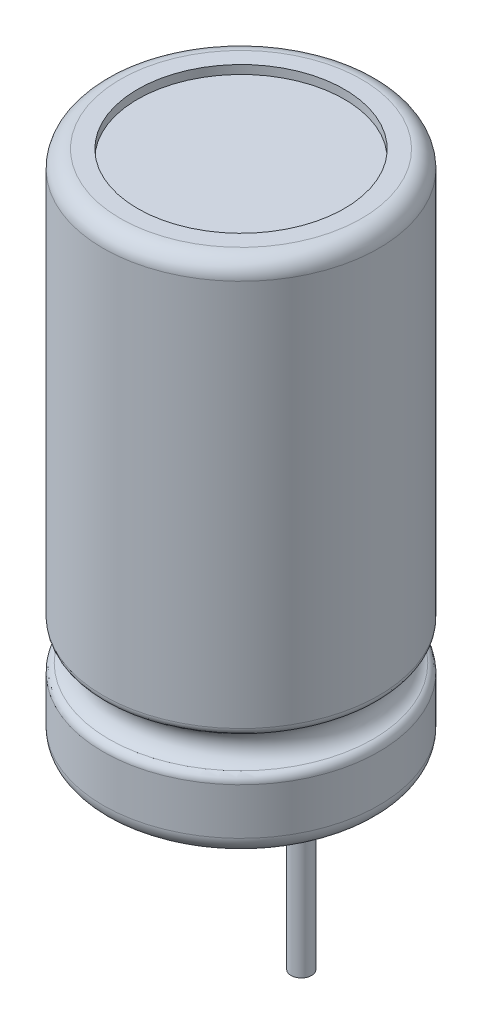
ISO-10303-21;
HEADER;
FILE_DESCRIPTION(('STEP AP214'),'2;1');
FILE_NAME('part.step','',(''),(''),'','','');
FILE_SCHEMA(('AUTOMOTIVE_DESIGN { 1 0 10303 214 1 1 1 1 }'));
ENDSEC;
DATA;
#1=APPLICATION_CONTEXT('core data for automotive mechanical design processes');
#2=APPLICATION_PROTOCOL_DEFINITION('international standard','automotive_design',2000,#1);
#3=PRODUCT_CONTEXT('',#1,'mechanical');
#4=PRODUCT('Part','Part','',(#3));
#5=PRODUCT_RELATED_PRODUCT_CATEGORY('part','',(#4));
#6=PRODUCT_DEFINITION_FORMATION('','',#4);
#7=PRODUCT_DEFINITION_CONTEXT('part definition',#1,'design');
#8=PRODUCT_DEFINITION('design','',#6,#7);
#9=PRODUCT_DEFINITION_SHAPE('','',#8);
#10=(LENGTH_UNIT() NAMED_UNIT(*) SI_UNIT(.MILLI.,.METRE.));
#11=(NAMED_UNIT(*) PLANE_ANGLE_UNIT() SI_UNIT($,.RADIAN.));
#12=(NAMED_UNIT(*) SI_UNIT($,.STERADIAN.) SOLID_ANGLE_UNIT());
#13=UNCERTAINTY_MEASURE_WITH_UNIT(LENGTH_MEASURE(1.E-05),#10,'distance_accuracy_value','');
#14=(GEOMETRIC_REPRESENTATION_CONTEXT(3) GLOBAL_UNCERTAINTY_ASSIGNED_CONTEXT((#13)) GLOBAL_UNIT_ASSIGNED_CONTEXT((#10,
#11,#12)) REPRESENTATION_CONTEXT('',''));
#15=CARTESIAN_POINT('',(0.,0.,0.));
#16=DIRECTION('',(0.,0.,1.));
#17=DIRECTION('',(1.,0.,0.));
#18=AXIS2_PLACEMENT_3D('',#15,#16,#17);
#19=CARTESIAN_POINT('',(-1.75,-4.75,0.));
#20=DIRECTION('',(0.,1.,0.));
#21=DIRECTION('',(0.,0.,1.));
#22=AXIS2_PLACEMENT_3D('',#19,#20,#21);
#23=CYLINDRICAL_SURFACE('',#22,0.3);
#24=CARTESIAN_POINT('',(-1.75,0.25,0.));
#25=DIRECTION('',(0.,-1.,0.));
#26=DIRECTION('',(0.,0.,-1.));
#27=AXIS2_PLACEMENT_3D('',#24,#25,#26);
#28=CIRCLE('',#27,0.3);
#29=CARTESIAN_POINT('',(-1.75,0.25,-0.3));
#30=VERTEX_POINT('',#29);
#31=EDGE_CURVE('E69',#30,#30,#28,.T.);
#32=ORIENTED_EDGE('',*,*,#31,.T.);
#33=EDGE_LOOP('',(#32));
#34=FACE_BOUND('',#33,.T.);
#35=CARTESIAN_POINT('',(-1.75,-1.75,0.));
#36=DIRECTION('',(0.,-1.,0.));
#37=DIRECTION('',(0.,0.,-1.));
#38=AXIS2_PLACEMENT_3D('',#35,#36,#37);
#39=CIRCLE('',#38,0.3);
#40=CARTESIAN_POINT('',(-1.75,-1.75,-0.3));
#41=VERTEX_POINT('',#40);
#42=EDGE_CURVE('E78',#41,#41,#39,.T.);
#43=ORIENTED_EDGE('',*,*,#42,.F.);
#44=EDGE_LOOP('',(#43));
#45=FACE_BOUND('',#44,.T.);
#46=ADVANCED_FACE('F33',(#34,#45),#23,.T.);
#47=CARTESIAN_POINT('',(0.,0.25,0.));
#48=DIRECTION('',(0.,-1.,0.));
#49=DIRECTION('',(0.,0.,-1.));
#50=AXIS2_PLACEMENT_3D('',#47,#48,#49);
#51=PLANE('',#50);
#52=ORIENTED_EDGE('',*,*,#31,.F.);
#53=EDGE_LOOP('',(#52));
#54=FACE_BOUND('',#53,.T.);
#55=CARTESIAN_POINT('',(0.,0.25,0.));
#56=DIRECTION('',(0.,-1.,0.));
#57=DIRECTION('',(0.,0.,-1.));
#58=AXIS2_PLACEMENT_3D('',#55,#56,#57);
#59=CIRCLE('',#58,3.);
#60=CARTESIAN_POINT('',(0.,0.25,-3.));
#61=VERTEX_POINT('',#60);
#62=EDGE_CURVE('E65',#61,#61,#59,.T.);
#63=ORIENTED_EDGE('',*,*,#62,.T.);
#64=EDGE_LOOP('',(#63));
#65=FACE_BOUND('',#64,.T.);
#66=CARTESIAN_POINT('',(1.75,0.25,0.));
#67=DIRECTION('',(0.,-1.,0.));
#68=DIRECTION('',(0.,0.,-1.));
#69=AXIS2_PLACEMENT_3D('',#66,#67,#68);
#70=CIRCLE('',#69,0.3);
#71=CARTESIAN_POINT('',(1.75,0.25,-0.3));
#72=VERTEX_POINT('',#71);
#73=EDGE_CURVE('E75',#72,#72,#70,.T.);
#74=ORIENTED_EDGE('',*,*,#73,.F.);
#75=EDGE_LOOP('',(#74));
#76=FACE_BOUND('',#75,.T.);
#77=ADVANCED_FACE('F122',(#54,#65,#76),#51,.T.);
#78=CARTESIAN_POINT('',(0.,15.,0.));
#79=DIRECTION('',(0.,-1.,0.));
#80=DIRECTION('',(0.,0.,-1.));
#81=AXIS2_PLACEMENT_3D('',#78,#79,#80);
#82=CYLINDRICAL_SURFACE('',#81,4.);
#83=CARTESIAN_POINT('',(0.,1.84607916782785,0.));
#84=DIRECTION('',(0.,1.,0.));
#85=DIRECTION('',(0.,0.,1.));
#86=AXIS2_PLACEMENT_3D('',#83,#84,#85);
#87=CIRCLE('',#86,4.);
#88=CARTESIAN_POINT('',(0.,1.84607916782785,4.));
#89=VERTEX_POINT('',#88);
#90=EDGE_CURVE('E48',#89,#89,#87,.F.);
#91=ORIENTED_EDGE('',*,*,#90,.T.);
#92=EDGE_LOOP('',(#91));
#93=FACE_BOUND('',#92,.T.);
#94=CARTESIAN_POINT('',(0.,0.5,0.));
#95=DIRECTION('',(0.,1.,0.));
#96=DIRECTION('',(0.,0.,1.));
#97=AXIS2_PLACEMENT_3D('',#94,#95,#96);
#98=CIRCLE('',#97,4.);
#99=CARTESIAN_POINT('',(0.,0.5,4.));
#100=VERTEX_POINT('',#99);
#101=EDGE_CURVE('E62',#100,#100,#98,.T.);
#102=ORIENTED_EDGE('',*,*,#101,.T.);
#103=EDGE_LOOP('',(#102));
#104=FACE_BOUND('',#103,.T.);
#105=ADVANCED_FACE('F128',(#93,#104),#82,.T.);
#106=CARTESIAN_POINT('',(0.,0.,0.));
#107=DIRECTION('',(0.,1.,0.));
#108=DIRECTION('',(0.,0.,1.));
#109=AXIS2_PLACEMENT_3D('',#106,#107,#108);
#110=PLANE('',#109);
#111=CARTESIAN_POINT('',(0.,0.,0.));
#112=DIRECTION('',(0.,-1.,0.));
#113=DIRECTION('',(0.,0.,-1.));
#114=AXIS2_PLACEMENT_3D('',#111,#112,#113);
#115=CIRCLE('',#114,3.);
#116=CARTESIAN_POINT('',(0.,0.,-3.));
#117=VERTEX_POINT('',#116);
#118=EDGE_CURVE('E66',#117,#117,#115,.T.);
#119=ORIENTED_EDGE('',*,*,#118,.F.);
#120=EDGE_LOOP('',(#119));
#121=FACE_BOUND('',#120,.T.);
#122=CARTESIAN_POINT('',(0.,0.,0.));
#123=DIRECTION('',(0.,1.,0.));
#124=DIRECTION('',(0.,0.,1.));
#125=AXIS2_PLACEMENT_3D('',#122,#123,#124);
#126=CIRCLE('',#125,3.5);
#127=CARTESIAN_POINT('',(0.,0.,3.5));
#128=VERTEX_POINT('',#127);
#129=EDGE_CURVE('E59',#128,#128,#126,.F.);
#130=ORIENTED_EDGE('',*,*,#129,.T.);
#131=EDGE_LOOP('',(#130));
#132=FACE_BOUND('',#131,.T.);
#133=ADVANCED_FACE('F141',(#121,#132),#110,.F.);
#134=CARTESIAN_POINT('',(0.,2.5531859490144,0.));
#135=DIRECTION('',(0.,-1.,0.));
#136=DIRECTION('',(0.,0.,-1.));
#137=AXIS2_PLACEMENT_3D('',#134,#135,#136);
#138=TOROIDAL_SURFACE('',#137,4.,0.5);
#139=CARTESIAN_POINT('',(0.,2.08178142822341,0.));
#140=DIRECTION('',(0.,1.,0.));
#141=DIRECTION('',(0.,0.,1.));
#142=AXIS2_PLACEMENT_3D('',#139,#140,#141);
#143=CIRCLE('',#142,3.83333333333335);
#144=CARTESIAN_POINT('',(0.,2.08178142822341,3.83333333333335));
#145=VERTEX_POINT('',#144);
#146=EDGE_CURVE('E40',#145,#145,#143,.T.);
#147=ORIENTED_EDGE('',*,*,#146,.T.);
#148=EDGE_LOOP('',(#147));
#149=FACE_BOUND('',#148,.T.);
#150=CARTESIAN_POINT('',(0.,3.02459046980538,0.));
#151=DIRECTION('',(0.,-1.,0.));
#152=DIRECTION('',(0.,0.,-1.));
#153=AXIS2_PLACEMENT_3D('',#150,#151,#152);
#154=CIRCLE('',#153,3.83333333333335);
#155=CARTESIAN_POINT('',(0.,3.02459046980538,-3.83333333333335));
#156=VERTEX_POINT('',#155);
#157=EDGE_CURVE('E44',#156,#156,#154,.T.);
#158=ORIENTED_EDGE('',*,*,#157,.T.);
#159=EDGE_LOOP('',(#158));
#160=FACE_BOUND('',#159,.T.);
#161=ADVANCED_FACE('F103',(#149,#160),#138,.F.);
#162=CARTESIAN_POINT('',(0.,15.,0.));
#163=DIRECTION('',(0.,1.,0.));
#164=DIRECTION('',(0.,0.,1.));
#165=AXIS2_PLACEMENT_3D('',#162,#163,#164);
#166=PLANE('',#165);
#167=CARTESIAN_POINT('',(0.,15.,0.));
#168=DIRECTION('',(0.,1.,0.));
#169=DIRECTION('',(0.,0.,1.));
#170=AXIS2_PLACEMENT_3D('',#167,#168,#169);
#171=CIRCLE('',#170,3.);
#172=CARTESIAN_POINT('',(0.,15.,3.));
#173=VERTEX_POINT('',#172);
#174=EDGE_CURVE('E84',#173,#173,#171,.T.);
#175=ORIENTED_EDGE('',*,*,#174,.F.);
#176=EDGE_LOOP('',(#175));
#177=FACE_BOUND('',#176,.T.);
#178=CARTESIAN_POINT('',(0.,15.,0.));
#179=DIRECTION('',(0.,1.,0.));
#180=DIRECTION('',(0.,0.,1.));
#181=AXIS2_PLACEMENT_3D('',#178,#179,#180);
#182=CIRCLE('',#181,3.5);
#183=CARTESIAN_POINT('',(0.,15.,3.5));
#184=VERTEX_POINT('',#183);
#185=EDGE_CURVE('E56',#184,#184,#182,.T.);
#186=ORIENTED_EDGE('',*,*,#185,.T.);
#187=EDGE_LOOP('',(#186));
#188=FACE_BOUND('',#187,.T.);
#189=ADVANCED_FACE('F99',(#177,#188),#166,.T.);
#190=CARTESIAN_POINT('',(0.,3.26029273020095,0.));
#191=DIRECTION('',(0.,1.,0.));
#192=DIRECTION('',(0.,0.,1.));
#193=AXIS2_PLACEMENT_3D('',#190,#191,#192);
#194=CIRCLE('',#193,4.);
#195=CARTESIAN_POINT('',(0.,3.26029273020095,4.));
#196=VERTEX_POINT('',#195);
#197=EDGE_CURVE('E10',#196,#196,#194,.T.);
#198=ORIENTED_EDGE('',*,*,#197,.T.);
#199=EDGE_LOOP('',(#198));
#200=FACE_BOUND('',#199,.T.);
#201=CARTESIAN_POINT('',(0.,14.5,0.));
#202=DIRECTION('',(0.,1.,0.));
#203=DIRECTION('',(0.,0.,1.));
#204=AXIS2_PLACEMENT_3D('',#201,#202,#203);
#205=CIRCLE('',#204,4.);
#206=CARTESIAN_POINT('',(0.,14.5,4.));
#207=VERTEX_POINT('',#206);
#208=EDGE_CURVE('E53',#207,#207,#205,.F.);
#209=ORIENTED_EDGE('',*,*,#208,.T.);
#210=EDGE_LOOP('',(#209));
#211=FACE_BOUND('',#210,.T.);
#212=ADVANCED_FACE('F102',(#200,#211),#82,.T.);
#213=CARTESIAN_POINT('',(0.,0.5,0.));
#214=DIRECTION('',(0.,1.,0.));
#215=DIRECTION('',(0.,0.,1.));
#216=AXIS2_PLACEMENT_3D('',#213,#214,#215);
#217=TOROIDAL_SURFACE('',#216,3.5,0.5);
#218=ORIENTED_EDGE('',*,*,#129,.F.);
#219=EDGE_LOOP('',(#218));
#220=FACE_BOUND('',#219,.T.);
#221=ORIENTED_EDGE('',*,*,#101,.F.);
#222=EDGE_LOOP('',(#221));
#223=FACE_BOUND('',#222,.T.);
#224=ADVANCED_FACE('F110',(#220,#223),#217,.T.);
#225=CARTESIAN_POINT('',(0.,14.5,0.));
#226=DIRECTION('',(0.,1.,0.));
#227=DIRECTION('',(0.,0.,1.));
#228=AXIS2_PLACEMENT_3D('',#225,#226,#227);
#229=TOROIDAL_SURFACE('',#228,3.5,0.5);
#230=ORIENTED_EDGE('',*,*,#208,.F.);
#231=EDGE_LOOP('',(#230));
#232=FACE_BOUND('',#231,.T.);
#233=ORIENTED_EDGE('',*,*,#185,.F.);
#234=EDGE_LOOP('',(#233));
#235=FACE_BOUND('',#234,.T.);
#236=ADVANCED_FACE('F107',(#232,#235),#229,.T.);
#237=CARTESIAN_POINT('',(0.,1.84607916782785,0.));
#238=DIRECTION('',(0.,1.,0.));
#239=DIRECTION('',(0.,0.,1.));
#240=AXIS2_PLACEMENT_3D('',#237,#238,#239);
#241=TOROIDAL_SURFACE('',#240,3.75,0.25);
#242=ORIENTED_EDGE('',*,*,#146,.F.);
#243=EDGE_LOOP('',(#242));
#244=FACE_BOUND('',#243,.T.);
#245=ORIENTED_EDGE('',*,*,#90,.F.);
#246=EDGE_LOOP('',(#245));
#247=FACE_BOUND('',#246,.T.);
#248=ADVANCED_FACE('F109',(#244,#247),#241,.T.);
#249=CARTESIAN_POINT('',(0.,3.26029273020095,0.));
#250=DIRECTION('',(0.,1.,0.));
#251=DIRECTION('',(0.,0.,1.));
#252=AXIS2_PLACEMENT_3D('',#249,#250,#251);
#253=TOROIDAL_SURFACE('',#252,3.75,0.25);
#254=ORIENTED_EDGE('',*,*,#197,.F.);
#255=EDGE_LOOP('',(#254));
#256=FACE_BOUND('',#255,.T.);
#257=ORIENTED_EDGE('',*,*,#157,.F.);
#258=EDGE_LOOP('',(#257));
#259=FACE_BOUND('',#258,.T.);
#260=ADVANCED_FACE('F35',(#256,#259),#253,.T.);
#261=CARTESIAN_POINT('',(0.,0.25,0.));
#262=DIRECTION('',(0.,-1.,0.));
#263=DIRECTION('',(0.,0.,-1.));
#264=AXIS2_PLACEMENT_3D('',#261,#262,#263);
#265=CYLINDRICAL_SURFACE('',#264,3.);
#266=ORIENTED_EDGE('',*,*,#62,.F.);
#267=EDGE_LOOP('',(#266));
#268=FACE_BOUND('',#267,.T.);
#269=ORIENTED_EDGE('',*,*,#118,.T.);
#270=EDGE_LOOP('',(#269));
#271=FACE_BOUND('',#270,.T.);
#272=ADVANCED_FACE('F136',(#268,#271),#265,.F.);
#273=CARTESIAN_POINT('',(1.75,-4.75,0.));
#274=DIRECTION('',(0.,1.,0.));
#275=DIRECTION('',(0.,0.,1.));
#276=AXIS2_PLACEMENT_3D('',#273,#274,#275);
#277=CYLINDRICAL_SURFACE('',#276,0.3);
#278=CARTESIAN_POINT('',(1.75,-4.75,0.));
#279=DIRECTION('',(0.,-1.,0.));
#280=DIRECTION('',(0.,0.,-1.));
#281=AXIS2_PLACEMENT_3D('',#278,#279,#280);
#282=CIRCLE('',#281,0.3);
#283=CARTESIAN_POINT('',(1.75,-4.75,-0.3));
#284=VERTEX_POINT('',#283);
#285=EDGE_CURVE('E74',#284,#284,#282,.T.);
#286=ORIENTED_EDGE('',*,*,#285,.F.);
#287=EDGE_LOOP('',(#286));
#288=FACE_BOUND('',#287,.T.);
#289=ORIENTED_EDGE('',*,*,#73,.T.);
#290=EDGE_LOOP('',(#289));
#291=FACE_BOUND('',#290,.T.);
#292=ADVANCED_FACE('F133',(#288,#291),#277,.T.);
#293=CARTESIAN_POINT('',(1.75,-4.75,0.));
#294=DIRECTION('',(0.,-1.,0.));
#295=DIRECTION('',(0.,0.,-1.));
#296=AXIS2_PLACEMENT_3D('',#293,#294,#295);
#297=PLANE('',#296);
#298=ORIENTED_EDGE('',*,*,#285,.T.);
#299=EDGE_LOOP('',(#298));
#300=FACE_BOUND('',#299,.T.);
#301=ADVANCED_FACE('F211',(#300),#297,.T.);
#302=CARTESIAN_POINT('',(-1.75,-1.75,0.));
#303=DIRECTION('',(0.,-1.,0.));
#304=DIRECTION('',(0.,0.,-1.));
#305=AXIS2_PLACEMENT_3D('',#302,#303,#304);
#306=PLANE('',#305);
#307=ORIENTED_EDGE('',*,*,#42,.T.);
#308=EDGE_LOOP('',(#307));
#309=FACE_BOUND('',#308,.T.);
#310=ADVANCED_FACE('F95',(#309),#306,.T.);
#311=CARTESIAN_POINT('',(0.,14.75,0.));
#312=DIRECTION('',(0.,1.,0.));
#313=DIRECTION('',(0.,0.,1.));
#314=AXIS2_PLACEMENT_3D('',#311,#312,#313);
#315=CYLINDRICAL_SURFACE('',#314,3.);
#316=CARTESIAN_POINT('',(0.,14.75,0.));
#317=DIRECTION('',(0.,1.,0.));
#318=DIRECTION('',(0.,0.,1.));
#319=AXIS2_PLACEMENT_3D('',#316,#317,#318);
#320=CIRCLE('',#319,3.);
#321=CARTESIAN_POINT('',(0.,14.75,3.));
#322=VERTEX_POINT('',#321);
#323=EDGE_CURVE('E83',#322,#322,#320,.T.);
#324=ORIENTED_EDGE('',*,*,#323,.F.);
#325=EDGE_LOOP('',(#324));
#326=FACE_BOUND('',#325,.T.);
#327=ORIENTED_EDGE('',*,*,#174,.T.);
#328=EDGE_LOOP('',(#327));
#329=FACE_BOUND('',#328,.T.);
#330=ADVANCED_FACE('F92',(#326,#329),#315,.F.);
#331=CARTESIAN_POINT('',(0.,14.75,0.));
#332=DIRECTION('',(0.,1.,0.));
#333=DIRECTION('',(0.,0.,1.));
#334=AXIS2_PLACEMENT_3D('',#331,#332,#333);
#335=PLANE('',#334);
#336=ORIENTED_EDGE('',*,*,#323,.T.);
#337=EDGE_LOOP('',(#336));
#338=FACE_BOUND('',#337,.T.);
#339=ADVANCED_FACE('F90',(#338),#335,.T.);
#340=CLOSED_SHELL('',(#46,#77,#105,#133,#161,#189,#212,#224,#236,#248,#260,#272,#292,#301,#310,
#330,#339));
#341=MANIFOLD_SOLID_BREP('B2',#340);
#342=ADVANCED_BREP_SHAPE_REPRESENTATION('',(#18,#341),#14);
#343=SHAPE_DEFINITION_REPRESENTATION(#9,#342);
ENDSEC;
END-ISO-10303-21;
